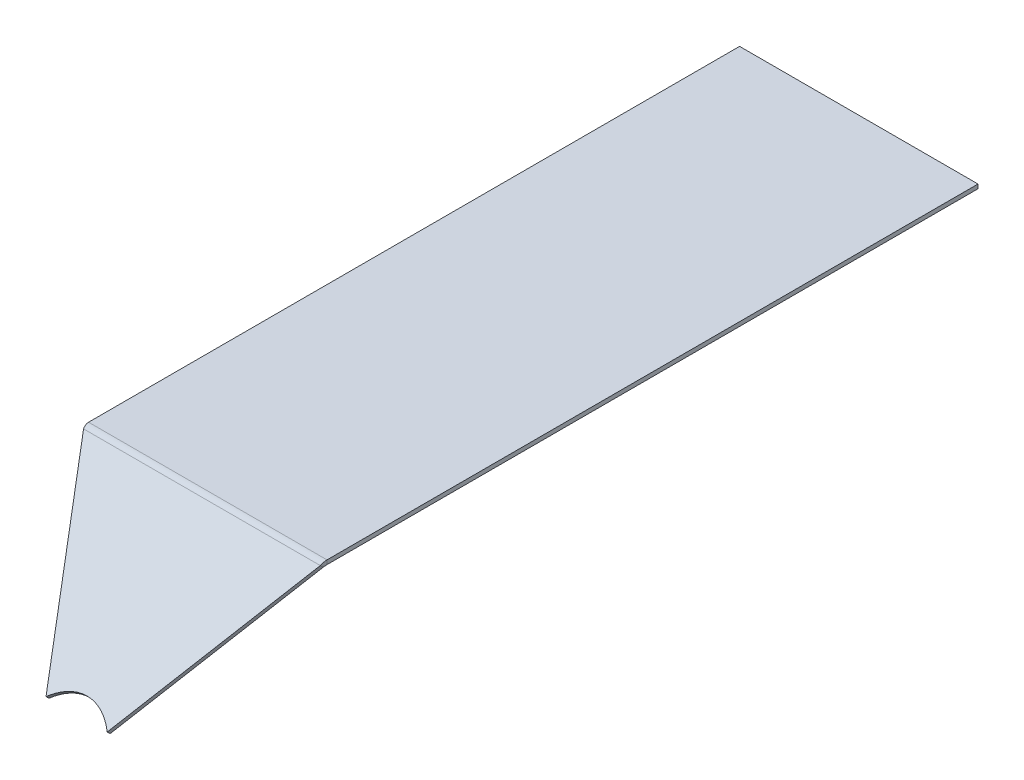
ISO-10303-21;
HEADER;
FILE_DESCRIPTION(('STEP AP214'),'2;1');
FILE_NAME('part.step','',(''),(''),'','','');
FILE_SCHEMA(('AUTOMOTIVE_DESIGN { 1 0 10303 214 1 1 1 1 }'));
ENDSEC;
DATA;
#1=APPLICATION_CONTEXT('core data for automotive mechanical design processes');
#2=APPLICATION_PROTOCOL_DEFINITION('international standard','automotive_design',2000,#1);
#3=PRODUCT_CONTEXT('',#1,'mechanical');
#4=PRODUCT('Part','Part','',(#3));
#5=PRODUCT_RELATED_PRODUCT_CATEGORY('part','',(#4));
#6=PRODUCT_DEFINITION_FORMATION('','',#4);
#7=PRODUCT_DEFINITION_CONTEXT('part definition',#1,'design');
#8=PRODUCT_DEFINITION('design','',#6,#7);
#9=PRODUCT_DEFINITION_SHAPE('','',#8);
#10=(LENGTH_UNIT() NAMED_UNIT(*) SI_UNIT(.MILLI.,.METRE.));
#11=(NAMED_UNIT(*) PLANE_ANGLE_UNIT() SI_UNIT($,.RADIAN.));
#12=(NAMED_UNIT(*) SI_UNIT($,.STERADIAN.) SOLID_ANGLE_UNIT());
#13=UNCERTAINTY_MEASURE_WITH_UNIT(LENGTH_MEASURE(1.E-05),#10,'distance_accuracy_value','');
#14=(GEOMETRIC_REPRESENTATION_CONTEXT(3) GLOBAL_UNCERTAINTY_ASSIGNED_CONTEXT((#13)) GLOBAL_UNIT_ASSIGNED_CONTEXT((#10,
#11,#12)) REPRESENTATION_CONTEXT('',''));
#15=CARTESIAN_POINT('',(0.,0.,0.));
#16=DIRECTION('',(0.,0.,1.));
#17=DIRECTION('',(1.,0.,0.));
#18=AXIS2_PLACEMENT_3D('',#15,#16,#17);
#19=CARTESIAN_POINT('',(-28.7792254112385,0.,0.));
#20=DIRECTION('',(1.,0.,0.));
#21=DIRECTION('',(0.,0.,-1.));
#22=AXIS2_PLACEMENT_3D('',#19,#20,#21);
#23=PLANE('',#22);
#24=DIRECTION('',(0.,-1.,0.));
#25=VECTOR('',#24,1.);
#26=CARTESIAN_POINT('',(-28.7792254112385,0.,-44.4142135623731));
#27=LINE('',#26,#25);
#28=CARTESIAN_POINT('',(-28.7792254112385,1.,-44.4142135623731));
#29=VERTEX_POINT('',#28);
#30=CARTESIAN_POINT('',(-28.7792254112385,0.,-44.4142135623731));
#31=VERTEX_POINT('',#30);
#32=EDGE_CURVE('E12',#29,#31,#27,.T.);
#33=ORIENTED_EDGE('',*,*,#32,.F.);
#34=DIRECTION('',(0.,0.,1.));
#35=VECTOR('',#34,1.);
#36=CARTESIAN_POINT('',(-28.7792254112385,1.,0.));
#37=LINE('',#36,#35);
#38=CARTESIAN_POINT('',(-28.7792254112385,1.,-201.573593128807));
#39=VERTEX_POINT('',#38);
#40=EDGE_CURVE('E90',#29,#39,#37,.F.);
#41=ORIENTED_EDGE('',*,*,#40,.T.);
#42=DIRECTION('',(0.,-1.,0.));
#43=VECTOR('',#42,1.);
#44=CARTESIAN_POINT('',(-28.7792254112385,0.,-201.573593128807));
#45=LINE('',#44,#43);
#46=CARTESIAN_POINT('',(-28.7792254112385,0.,-201.573593128807));
#47=VERTEX_POINT('',#46);
#48=EDGE_CURVE('E51',#39,#47,#45,.T.);
#49=ORIENTED_EDGE('',*,*,#48,.T.);
#50=DIRECTION('',(0.,0.,-1.));
#51=VECTOR('',#50,1.);
#52=CARTESIAN_POINT('',(-28.7792254112385,0.,0.));
#53=LINE('',#52,#51);
#54=EDGE_CURVE('E92',#31,#47,#53,.T.);
#55=ORIENTED_EDGE('',*,*,#54,.F.);
#56=EDGE_LOOP('',(#33,#41,#49,#55));
#57=FACE_BOUND('',#56,.T.);
#58=ADVANCED_FACE('F39',(#57),#23,.F.);
#59=CARTESIAN_POINT('',(-30.,0.,-201.573593128807));
#60=DIRECTION('',(0.,0.,-1.));
#61=DIRECTION('',(-1.,0.,0.));
#62=AXIS2_PLACEMENT_3D('',#59,#60,#61);
#63=PLANE('',#62);
#64=ORIENTED_EDGE('',*,*,#48,.F.);
#65=DIRECTION('',(1.,0.,0.));
#66=VECTOR('',#65,1.);
#67=CARTESIAN_POINT('',(0.,1.,-201.573593128807));
#68=LINE('',#67,#66);
#69=CARTESIAN_POINT('',(28.7792254112385,1.,-201.573593128807));
#70=VERTEX_POINT('',#69);
#71=EDGE_CURVE('E116',#70,#39,#68,.F.);
#72=ORIENTED_EDGE('',*,*,#71,.F.);
#73=DIRECTION('',(0.,-1.,0.));
#74=VECTOR('',#73,1.);
#75=CARTESIAN_POINT('',(28.7792254112385,0.,-201.573593128807));
#76=LINE('',#75,#74);
#77=CARTESIAN_POINT('',(28.7792254112385,0.,-201.573593128807));
#78=VERTEX_POINT('',#77);
#79=EDGE_CURVE('E136',#70,#78,#76,.T.);
#80=ORIENTED_EDGE('',*,*,#79,.T.);
#81=DIRECTION('',(-1.,0.,0.));
#82=VECTOR('',#81,1.);
#83=CARTESIAN_POINT('',(-30.,0.,-201.573593128807));
#84=LINE('',#83,#82);
#85=EDGE_CURVE('E149',#78,#47,#84,.T.);
#86=ORIENTED_EDGE('',*,*,#85,.T.);
#87=EDGE_LOOP('',(#64,#72,#80,#86));
#88=FACE_BOUND('',#87,.T.);
#89=ADVANCED_FACE('F156',(#88),#63,.T.);
#90=CARTESIAN_POINT('',(28.7792254112385,0.,0.));
#91=DIRECTION('',(-1.,0.,0.));
#92=DIRECTION('',(0.,0.,1.));
#93=AXIS2_PLACEMENT_3D('',#90,#91,#92);
#94=PLANE('',#93);
#95=ORIENTED_EDGE('',*,*,#79,.F.);
#96=DIRECTION('',(0.,0.,1.));
#97=VECTOR('',#96,1.);
#98=CARTESIAN_POINT('',(28.7792254112385,1.,0.));
#99=LINE('',#98,#97);
#100=CARTESIAN_POINT('',(28.7792254112385,1.,-44.4142135623731));
#101=VERTEX_POINT('',#100);
#102=EDGE_CURVE('E118',#70,#101,#99,.T.);
#103=ORIENTED_EDGE('',*,*,#102,.T.);
#104=DIRECTION('',(0.,-1.,0.));
#105=VECTOR('',#104,1.);
#106=CARTESIAN_POINT('',(28.7792254112385,0.,-44.4142135623731));
#107=LINE('',#106,#105);
#108=CARTESIAN_POINT('',(28.7792254112385,0.,-44.4142135623731));
#109=VERTEX_POINT('',#108);
#110=EDGE_CURVE('E133',#101,#109,#107,.T.);
#111=ORIENTED_EDGE('',*,*,#110,.T.);
#112=DIRECTION('',(0.,0.,1.));
#113=VECTOR('',#112,1.);
#114=CARTESIAN_POINT('',(28.7792254112385,0.,0.));
#115=LINE('',#114,#113);
#116=EDGE_CURVE('E154',#78,#109,#115,.T.);
#117=ORIENTED_EDGE('',*,*,#116,.F.);
#118=EDGE_LOOP('',(#95,#103,#111,#117));
#119=FACE_BOUND('',#118,.T.);
#120=ADVANCED_FACE('F189',(#119),#94,.F.);
#121=CARTESIAN_POINT('',(28.7792254112385,1.,-44.4142135623731));
#122=CARTESIAN_POINT('',(28.7792254112385,0.666666666666667,-44.4142135623731));
#123=CARTESIAN_POINT('',(28.7792254112385,0.333333333333333,-44.4142135623731));
#124=CARTESIAN_POINT('',(28.7792254112385,0.,-44.4142135623731));
#125=CARTESIAN_POINT('',(28.7792254112385,1.,-40.4142135623731));
#126=CARTESIAN_POINT('',(28.7792254112385,0.666666666666667,-41.0808802290398));
#127=CARTESIAN_POINT('',(28.7792254112385,0.333333333333333,-41.7475468957064));
#128=CARTESIAN_POINT('',(28.7792254112385,0.,-42.4142135623731));
#129=CARTESIAN_POINT('',(27.3788103348191,-3.,-40.4142135623731));
#130=CARTESIAN_POINT('',(27.3788103348191,-2.66666666666667,-41.0808802290398));
#131=CARTESIAN_POINT('',(27.3788103348191,-2.33333333333333,-41.7475468957064));
#132=CARTESIAN_POINT('',(27.3788103348191,-2.,-42.4142135623731));
#133=CARTESIAN_POINT('',(27.3788103348191,-3.,-44.4142135623731));
#134=CARTESIAN_POINT('',(27.3788103348191,-2.66666666666667,-44.4142135623731));
#135=CARTESIAN_POINT('',(27.3788103348191,-2.33333333333333,-44.4142135623731));
#136=CARTESIAN_POINT('',(27.3788103348191,-2.,-44.4142135623731));
#137=CARTESIAN_POINT('',(27.3788103348191,-3.,-48.4142135623731));
#138=CARTESIAN_POINT('',(27.3788103348191,-2.66666666666667,-47.7475468957065));
#139=CARTESIAN_POINT('',(27.3788103348191,-2.33333333333333,-47.0808802290398));
#140=CARTESIAN_POINT('',(27.3788103348191,-2.,-46.4142135623731));
#141=CARTESIAN_POINT('',(28.7792254112385,1.,-48.4142135623731));
#142=CARTESIAN_POINT('',(28.7792254112385,0.666666666666667,-47.7475468957065));
#143=CARTESIAN_POINT('',(28.7792254112385,0.333333333333333,-47.0808802290398));
#144=CARTESIAN_POINT('',(28.7792254112385,0.,-46.4142135623731));
#145=CARTESIAN_POINT('',(28.7792254112385,1.,-44.4142135623731));
#146=CARTESIAN_POINT('',(28.7792254112385,0.666666666666667,-44.4142135623731));
#147=CARTESIAN_POINT('',(28.7792254112385,0.333333333333333,-44.4142135623731));
#148=CARTESIAN_POINT('',(28.7792254112385,0.,-44.4142135623731));
#149=(BOUNDED_SURFACE() B_SPLINE_SURFACE(3,3,((#121,#122,#123,#124),(#125,#126,#127,#128),(#129,
#130,#131,#132),(#133,#134,#135,#136),(#137,#138,#139,#140),(#141,#142,#143,#144),(#145,#146,
#147,#148)),.UNSPECIFIED.,.T.,.F.,.F.) B_SPLINE_SURFACE_WITH_KNOTS((4,3,4),(4,4),(0.,0.5,1.),
(0.,1.),.UNSPECIFIED.) GEOMETRIC_REPRESENTATION_ITEM() RATIONAL_B_SPLINE_SURFACE(((1.,1.,1.,1.),
(0.333333333333333,0.333333333333333,0.333333333333333,0.333333333333333),(0.333333333333333,
0.333333333333333,0.333333333333333,0.333333333333333),(1.,1.,1.,1.),(0.333333333333333,
0.333333333333333,0.333333333333333,0.333333333333333),(0.333333333333333,0.333333333333333,
0.333333333333333,0.333333333333333),(1.,1.,1.,1.))) REPRESENTATION_ITEM('') SURFACE());
#150=CARTESIAN_POINT('',(28.0790178730288,-1.,-44.4142135623731));
#151=DIRECTION('',(-0.943827814196333,0.330437675136132,0.));
#152=DIRECTION('',(0.330437675136132,0.943827814196333,0.));
#153=AXIS2_PLACEMENT_3D('',#150,#151,#152);
#154=ELLIPSE('',#153,2.11903057943148,2.);
#155=CARTESIAN_POINT('',(28.5741393715349,0.414213562373079,-43.));
#156=VERTEX_POINT('',#155);
#157=EDGE_CURVE('E106',#101,#156,#154,.F.);
#158=DIRECTION('',(0.,-0.707106781186549,-0.707106781186546));
#159=VECTOR('',#158,1.);
#160=CARTESIAN_POINT('',(28.5741393715349,-0.292893218813456,-43.7071067811865));
#161=LINE('',#160,#159);
#162=CARTESIAN_POINT('',(28.5741393715349,-0.292893218813456,-43.7071067811865));
#163=VERTEX_POINT('',#162);
#164=EDGE_CURVE('E131',#156,#163,#161,.T.);
#165=CARTESIAN_POINT('',(28.0790178730288,-1.,-44.4142135623731));
#166=DIRECTION('',(-0.819152044288993,0.573576436351044,0.));
#167=DIRECTION('',(0.573576436351044,0.819152044288993,0.));
#168=AXIS2_PLACEMENT_3D('',#165,#166,#167);
#169=ELLIPSE('',#168,1.22077458876145,1.);
#170=EDGE_CURVE('E157',#109,#163,#169,.F.);
#171=ORIENTED_EDGE('',*,*,#110,.F.);
#172=ORIENTED_EDGE('',*,*,#157,.T.);
#173=ORIENTED_EDGE('',*,*,#164,.T.);
#174=ORIENTED_EDGE('',*,*,#170,.F.);
#175=EDGE_LOOP('',(#171,#172,#173,#174));
#176=FACE_BOUND('',#175,.T.);
#177=ADVANCED_FACE('F183',(#176),#149,.T.);
#178=CARTESIAN_POINT('',(-16.3085684737657,-64.3920429652683,20.3920429652686));
#179=DIRECTION('',(-0.896169137511728,0.313752192798301,-0.313752192798302));
#180=DIRECTION('',(-0.443712606279656,-0.633687274224642,0.633687274224644));
#181=AXIS2_PLACEMENT_3D('',#178,#179,#180);
#182=PLANE('',#181);
#183=ORIENTED_EDGE('',*,*,#164,.F.);
#184=DIRECTION('',(-0.443712606279656,-0.633687274224642,0.633687274224644));
#185=VECTOR('',#184,1.);
#186=CARTESIAN_POINT('',(-16.3085684737657,-63.6849361840818,21.0991497464551));
#187=LINE('',#186,#185);
#188=CARTESIAN_POINT('',(7.39067745800036,-29.8389053453388,-12.746881092288));
#189=VERTEX_POINT('',#188);
#190=EDGE_CURVE('E117',#156,#189,#187,.T.);
#191=ORIENTED_EDGE('',*,*,#190,.T.);
#192=DIRECTION('',(0.,-0.707106781186549,-0.707106781186546));
#193=VECTOR('',#192,1.);
#194=CARTESIAN_POINT('',(7.39067745800037,-30.5460121265254,-13.4539878734746));
#195=LINE('',#194,#193);
#196=CARTESIAN_POINT('',(7.39067745800037,-30.5460121265254,-13.4539878734746));
#197=VERTEX_POINT('',#196);
#198=EDGE_CURVE('E128',#189,#197,#195,.T.);
#199=ORIENTED_EDGE('',*,*,#198,.T.);
#200=DIRECTION('',(-0.443712606279656,-0.633687274224642,0.633687274224644));
#201=VECTOR('',#200,1.);
#202=CARTESIAN_POINT('',(-16.3085684737657,-64.3920429652683,20.3920429652686));
#203=LINE('',#202,#201);
#204=EDGE_CURVE('E153',#163,#197,#203,.T.);
#205=ORIENTED_EDGE('',*,*,#204,.F.);
#206=EDGE_LOOP('',(#183,#191,#199,#205));
#207=FACE_BOUND('',#206,.T.);
#208=ADVANCED_FACE('F178',(#207),#182,.F.);
#209=CARTESIAN_POINT('',(0.,-40.,-3.99999999999987));
#210=DIRECTION('',(0.,0.707106781186549,0.707106781186546));
#211=DIRECTION('',(0.,0.707106781186546,-0.707106781186549));
#212=AXIS2_PLACEMENT_3D('',#209,#210,#211);
#213=ELLIPSE('',#212,16.9705627484772,12.);
#214=DIRECTION('',(0.,0.707106781186549,0.707106781186546));
#215=VECTOR('',#214,1.);
#216=SURFACE_OF_LINEAR_EXTRUSION('',#213,#215);
#217=ORIENTED_EDGE('',*,*,#198,.F.);
#218=CARTESIAN_POINT('',(0.,-39.2928932188135,-3.29289321881333));
#219=DIRECTION('',(0.,0.707106781186549,0.707106781186546));
#220=DIRECTION('',(0.,0.707106781186546,-0.707106781186549));
#221=AXIS2_PLACEMENT_3D('',#218,#219,#220);
#222=ELLIPSE('',#221,16.9705627484772,12.);
#223=CARTESIAN_POINT('',(-7.39067745800037,-29.8389053453388,-12.746881092288));
#224=VERTEX_POINT('',#223);
#225=EDGE_CURVE('E354',#224,#189,#222,.F.);
#226=ORIENTED_EDGE('',*,*,#225,.F.);
#227=DIRECTION('',(0.,-0.707106781186549,-0.707106781186546));
#228=VECTOR('',#227,1.);
#229=CARTESIAN_POINT('',(-7.39067745800036,-30.5460121265254,-13.4539878734745));
#230=LINE('',#229,#228);
#231=CARTESIAN_POINT('',(-7.39067745800036,-30.5460121265254,-13.4539878734745));
#232=VERTEX_POINT('',#231);
#233=EDGE_CURVE('E125',#224,#232,#230,.T.);
#234=ORIENTED_EDGE('',*,*,#233,.T.);
#235=EDGE_CURVE('E166',#232,#197,#213,.F.);
#236=ORIENTED_EDGE('',*,*,#235,.T.);
#237=EDGE_LOOP('',(#217,#226,#234,#236));
#238=FACE_BOUND('',#237,.T.);
#239=ADVANCED_FACE('F173',(#238),#216,.F.);
#240=CARTESIAN_POINT('',(4.49571585547659,-47.5215410445203,3.52154104452051));
#241=DIRECTION('',(0.896169137511728,0.313752192798301,-0.313752192798302));
#242=DIRECTION('',(-0.443712606279656,0.633687274224642,-0.633687274224644));
#243=AXIS2_PLACEMENT_3D('',#240,#241,#242);
#244=PLANE('',#243);
#245=ORIENTED_EDGE('',*,*,#233,.F.);
#246=DIRECTION('',(-0.443712606279656,0.633687274224642,-0.633687274224644));
#247=VECTOR('',#246,1.);
#248=CARTESIAN_POINT('',(4.49571585547659,-46.8144342633338,4.22864782570706));
#249=LINE('',#248,#247);
#250=CARTESIAN_POINT('',(-28.5741393715349,0.414213562373103,-43.));
#251=VERTEX_POINT('',#250);
#252=EDGE_CURVE('E111',#224,#251,#249,.T.);
#253=ORIENTED_EDGE('',*,*,#252,.T.);
#254=DIRECTION('',(0.,-0.707106781186548,-0.707106781186547));
#255=VECTOR('',#254,1.);
#256=CARTESIAN_POINT('',(-28.5741393715349,-0.292893218813449,-43.7071067811866));
#257=LINE('',#256,#255);
#258=CARTESIAN_POINT('',(-28.5741393715349,-0.292893218813449,-43.7071067811866));
#259=VERTEX_POINT('',#258);
#260=EDGE_CURVE('E45',#251,#259,#257,.T.);
#261=ORIENTED_EDGE('',*,*,#260,.T.);
#262=DIRECTION('',(-0.443712606279656,0.633687274224642,-0.633687274224644));
#263=VECTOR('',#262,1.);
#264=CARTESIAN_POINT('',(4.49571585547659,-47.5215410445203,3.52154104452051));
#265=LINE('',#264,#263);
#266=EDGE_CURVE('E170',#232,#259,#265,.T.);
#267=ORIENTED_EDGE('',*,*,#266,.F.);
#268=EDGE_LOOP('',(#245,#253,#261,#267));
#269=FACE_BOUND('',#268,.T.);
#270=ADVANCED_FACE('F177',(#269),#244,.F.);
#271=CARTESIAN_POINT('',(-27.3788103348191,-3.,-44.4142135623731));
#272=CARTESIAN_POINT('',(-27.3788103348191,-2.66666666666667,-44.4142135623731));
#273=CARTESIAN_POINT('',(-27.3788103348191,-2.33333333333333,-44.4142135623731));
#274=CARTESIAN_POINT('',(-27.3788103348191,-2.,-44.4142135623731));
#275=CARTESIAN_POINT('',(-27.3788103348191,-3.,-40.4142135623731));
#276=CARTESIAN_POINT('',(-27.3788103348191,-2.66666666666667,-41.0808802290398));
#277=CARTESIAN_POINT('',(-27.3788103348191,-2.33333333333333,-41.7475468957064));
#278=CARTESIAN_POINT('',(-27.3788103348191,-2.,-42.4142135623731));
#279=CARTESIAN_POINT('',(-28.7792254112385,1.,-40.4142135623731));
#280=CARTESIAN_POINT('',(-28.7792254112385,0.666666666666667,-41.0808802290398));
#281=CARTESIAN_POINT('',(-28.7792254112385,0.333333333333334,-41.7475468957064));
#282=CARTESIAN_POINT('',(-28.7792254112385,0.,-42.4142135623731));
#283=CARTESIAN_POINT('',(-28.7792254112385,1.,-44.4142135623731));
#284=CARTESIAN_POINT('',(-28.7792254112385,0.666666666666667,-44.4142135623731));
#285=CARTESIAN_POINT('',(-28.7792254112385,0.333333333333333,-44.4142135623731));
#286=CARTESIAN_POINT('',(-28.7792254112385,0.,-44.4142135623731));
#287=CARTESIAN_POINT('',(-28.7792254112385,1.,-48.4142135623731));
#288=CARTESIAN_POINT('',(-28.7792254112385,0.666666666666667,-47.7475468957065));
#289=CARTESIAN_POINT('',(-28.7792254112385,0.333333333333333,-47.0808802290398));
#290=CARTESIAN_POINT('',(-28.7792254112385,0.,-46.4142135623731));
#291=CARTESIAN_POINT('',(-27.3788103348191,-3.,-48.4142135623731));
#292=CARTESIAN_POINT('',(-27.3788103348191,-2.66666666666667,-47.7475468957065));
#293=CARTESIAN_POINT('',(-27.3788103348191,-2.33333333333333,-47.0808802290398));
#294=CARTESIAN_POINT('',(-27.3788103348191,-2.,-46.4142135623731));
#295=CARTESIAN_POINT('',(-27.3788103348191,-3.,-44.4142135623731));
#296=CARTESIAN_POINT('',(-27.3788103348191,-2.66666666666667,-44.4142135623731));
#297=CARTESIAN_POINT('',(-27.3788103348191,-2.33333333333333,-44.4142135623731));
#298=CARTESIAN_POINT('',(-27.3788103348191,-2.,-44.4142135623731));
#299=(BOUNDED_SURFACE() B_SPLINE_SURFACE(3,3,((#271,#272,#273,#274),(#275,#276,#277,#278),(#279,
#280,#281,#282),(#283,#284,#285,#286),(#287,#288,#289,#290),(#291,#292,#293,#294),(#295,#296,
#297,#298)),.UNSPECIFIED.,.T.,.F.,.F.) B_SPLINE_SURFACE_WITH_KNOTS((4,3,4),(4,4),(0.,0.5,1.),
(0.,1.),.UNSPECIFIED.) GEOMETRIC_REPRESENTATION_ITEM() RATIONAL_B_SPLINE_SURFACE(((1.,1.,1.,1.),
(0.333333333333333,0.333333333333333,0.333333333333333,0.333333333333333),(0.333333333333333,
0.333333333333333,0.333333333333333,0.333333333333333),(1.,1.,1.,1.),(0.333333333333333,
0.333333333333333,0.333333333333333,0.333333333333333),(0.333333333333333,0.333333333333333,
0.333333333333333,0.333333333333333),(1.,1.,1.,1.))) REPRESENTATION_ITEM('') SURFACE());
#300=CARTESIAN_POINT('',(-28.0790178730288,-1.,-44.4142135623731));
#301=DIRECTION('',(0.943827814196333,0.330437675136132,0.));
#302=DIRECTION('',(0.330437675136132,-0.943827814196333,0.));
#303=AXIS2_PLACEMENT_3D('',#300,#301,#302);
#304=ELLIPSE('',#303,2.11903057943148,2.);
#305=EDGE_CURVE('E104',#251,#29,#304,.F.);
#306=CARTESIAN_POINT('',(-28.0790178730288,-1.,-44.4142135623731));
#307=DIRECTION('',(0.819152044288993,0.573576436351044,0.));
#308=DIRECTION('',(0.573576436351044,-0.819152044288993,0.));
#309=AXIS2_PLACEMENT_3D('',#306,#307,#308);
#310=ELLIPSE('',#309,1.22077458876145,1.);
#311=EDGE_CURVE('E161',#259,#31,#310,.F.);
#312=ORIENTED_EDGE('',*,*,#305,.T.);
#313=ORIENTED_EDGE('',*,*,#32,.T.);
#314=ORIENTED_EDGE('',*,*,#311,.F.);
#315=ORIENTED_EDGE('',*,*,#260,.F.);
#316=EDGE_LOOP('',(#312,#313,#314,#315));
#317=FACE_BOUND('',#316,.T.);
#318=ADVANCED_FACE('F41',(#317),#299,.T.);
#319=CARTESIAN_POINT('',(-30.,-59.5986211834927,15.5986211834929));
#320=DIRECTION('',(0.,0.707106781186549,0.707106781186546));
#321=DIRECTION('',(0.,-0.707106781186546,0.707106781186549));
#322=AXIS2_PLACEMENT_3D('',#319,#320,#321);
#323=PLANE('',#322);
#324=ORIENTED_EDGE('',*,*,#266,.T.);
#325=DIRECTION('',(-1.,0.,0.));
#326=VECTOR('',#325,1.);
#327=CARTESIAN_POINT('',(28.7792254112385,-0.292893218813446,-43.7071067811866));
#328=LINE('',#327,#326);
#329=EDGE_CURVE('E368',#259,#163,#328,.F.);
#330=ORIENTED_EDGE('',*,*,#329,.T.);
#331=ORIENTED_EDGE('',*,*,#204,.T.);
#332=ORIENTED_EDGE('',*,*,#235,.F.);
#333=EDGE_LOOP('',(#324,#330,#331,#332));
#334=FACE_BOUND('',#333,.T.);
#335=ADVANCED_FACE('F234',(#334),#323,.F.);
#336=CARTESIAN_POINT('',(0.,0.,0.));
#337=DIRECTION('',(0.,1.,0.));
#338=DIRECTION('',(0.,0.,1.));
#339=AXIS2_PLACEMENT_3D('',#336,#337,#338);
#340=PLANE('',#339);
#341=ORIENTED_EDGE('',*,*,#116,.T.);
#342=DIRECTION('',(-1.,0.,0.));
#343=VECTOR('',#342,1.);
#344=CARTESIAN_POINT('',(-28.7792254112385,0.,-44.4142135623731));
#345=LINE('',#344,#343);
#346=EDGE_CURVE('E152',#109,#31,#345,.T.);
#347=ORIENTED_EDGE('',*,*,#346,.T.);
#348=ORIENTED_EDGE('',*,*,#54,.T.);
#349=ORIENTED_EDGE('',*,*,#85,.F.);
#350=EDGE_LOOP('',(#341,#347,#348,#349));
#351=FACE_BOUND('',#350,.T.);
#352=ADVANCED_FACE('F148',(#351),#340,.F.);
#353=CARTESIAN_POINT('',(0.,-1.,-44.4142135623731));
#354=DIRECTION('',(1.,0.,0.));
#355=DIRECTION('',(0.,0.,-1.));
#356=AXIS2_PLACEMENT_3D('',#353,#354,#355);
#357=CYLINDRICAL_SURFACE('',#356,1.);
#358=ORIENTED_EDGE('',*,*,#170,.T.);
#359=ORIENTED_EDGE('',*,*,#329,.F.);
#360=ORIENTED_EDGE('',*,*,#311,.T.);
#361=ORIENTED_EDGE('',*,*,#346,.F.);
#362=EDGE_LOOP('',(#358,#359,#360,#361));
#363=FACE_BOUND('',#362,.T.);
#364=ADVANCED_FACE('F247',(#363),#357,.F.);
#365=CARTESIAN_POINT('',(-30.,-58.8915144023062,16.3057279646795));
#366=DIRECTION('',(0.,0.707106781186549,0.707106781186546));
#367=DIRECTION('',(0.,-0.707106781186546,0.707106781186549));
#368=AXIS2_PLACEMENT_3D('',#365,#366,#367);
#369=PLANE('',#368);
#370=ORIENTED_EDGE('',*,*,#252,.F.);
#371=ORIENTED_EDGE('',*,*,#225,.T.);
#372=ORIENTED_EDGE('',*,*,#190,.F.);
#373=DIRECTION('',(1.,0.,0.));
#374=VECTOR('',#373,1.);
#375=CARTESIAN_POINT('',(-30.,0.414213562373103,-43.));
#376=LINE('',#375,#374);
#377=EDGE_CURVE('E110',#251,#156,#376,.T.);
#378=ORIENTED_EDGE('',*,*,#377,.F.);
#379=EDGE_LOOP('',(#370,#371,#372,#378));
#380=FACE_BOUND('',#379,.T.);
#381=ADVANCED_FACE('F254',(#380),#369,.T.);
#382=CARTESIAN_POINT('',(0.,1.,0.));
#383=DIRECTION('',(0.,1.,0.));
#384=DIRECTION('',(0.,0.,1.));
#385=AXIS2_PLACEMENT_3D('',#382,#383,#384);
#386=PLANE('',#385);
#387=ORIENTED_EDGE('',*,*,#102,.F.);
#388=ORIENTED_EDGE('',*,*,#71,.T.);
#389=ORIENTED_EDGE('',*,*,#40,.F.);
#390=DIRECTION('',(1.,0.,0.));
#391=VECTOR('',#390,1.);
#392=CARTESIAN_POINT('',(0.,1.,-44.4142135623731));
#393=LINE('',#392,#391);
#394=EDGE_CURVE('E101',#101,#29,#393,.F.);
#395=ORIENTED_EDGE('',*,*,#394,.F.);
#396=EDGE_LOOP('',(#387,#388,#389,#395));
#397=FACE_BOUND('',#396,.T.);
#398=ADVANCED_FACE('F114',(#397),#386,.T.);
#399=CARTESIAN_POINT('',(0.,-1.,-44.4142135623731));
#400=DIRECTION('',(1.,0.,0.));
#401=DIRECTION('',(0.,0.,-1.));
#402=AXIS2_PLACEMENT_3D('',#399,#400,#401);
#403=CYLINDRICAL_SURFACE('',#402,2.);
#404=ORIENTED_EDGE('',*,*,#157,.F.);
#405=ORIENTED_EDGE('',*,*,#394,.T.);
#406=ORIENTED_EDGE('',*,*,#305,.F.);
#407=ORIENTED_EDGE('',*,*,#377,.T.);
#408=EDGE_LOOP('',(#404,#405,#406,#407));
#409=FACE_BOUND('',#408,.T.);
#410=ADVANCED_FACE('F102',(#409),#403,.T.);
#411=CLOSED_SHELL('',(#58,#89,#120,#177,#208,#239,#270,#318,#335,#352,#364,#381,#398,#410));
#412=MANIFOLD_SOLID_BREP('B2',#411);
#413=ADVANCED_BREP_SHAPE_REPRESENTATION('',(#18,#412),#14);
#414=SHAPE_DEFINITION_REPRESENTATION(#9,#413);
ENDSEC;
END-ISO-10303-21;
